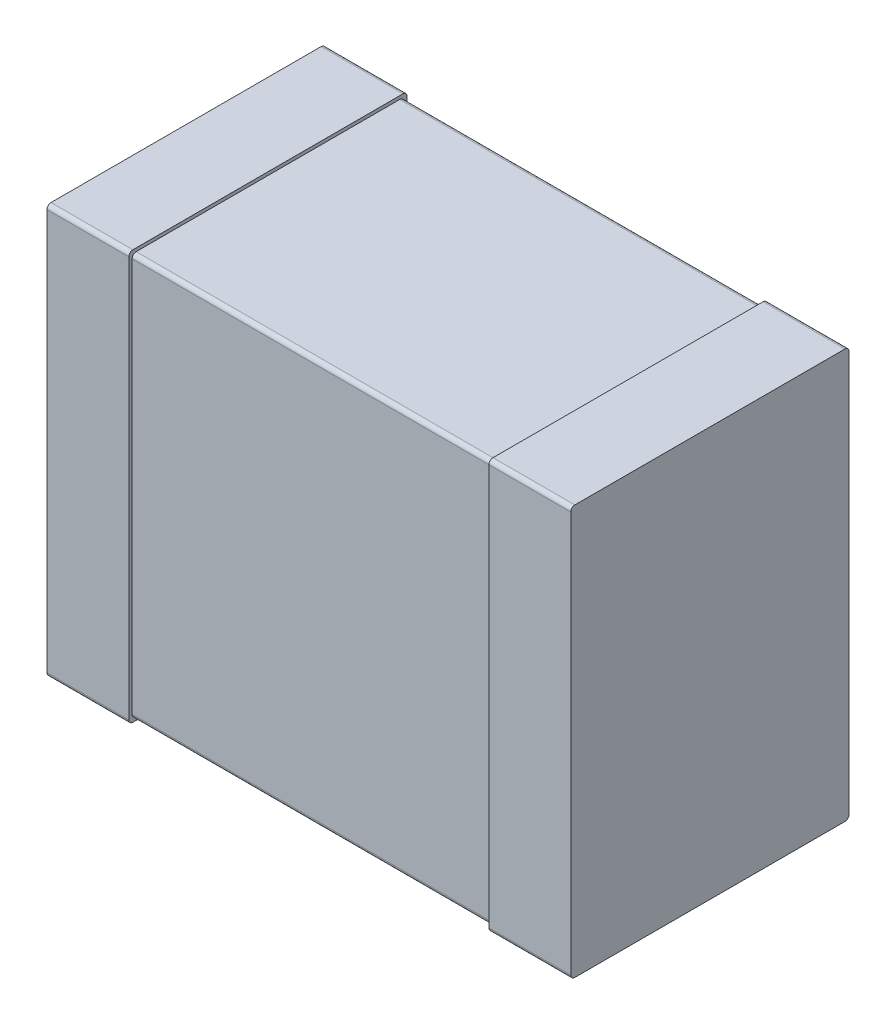
ISO-10303-21;
HEADER;
FILE_DESCRIPTION(('STEP AP214'),'2;1');
FILE_NAME('part.step','',(''),(''),'','','');
FILE_SCHEMA(('AUTOMOTIVE_DESIGN { 1 0 10303 214 1 1 1 1 }'));
ENDSEC;
DATA;
#1=APPLICATION_CONTEXT('core data for automotive mechanical design processes');
#2=APPLICATION_PROTOCOL_DEFINITION('international standard','automotive_design',2000,#1);
#3=PRODUCT_CONTEXT('',#1,'mechanical');
#4=PRODUCT('Part','Part','',(#3));
#5=PRODUCT_RELATED_PRODUCT_CATEGORY('part','',(#4));
#6=PRODUCT_DEFINITION_FORMATION('','',#4);
#7=PRODUCT_DEFINITION_CONTEXT('part definition',#1,'design');
#8=PRODUCT_DEFINITION('design','',#6,#7);
#9=PRODUCT_DEFINITION_SHAPE('','',#8);
#10=(LENGTH_UNIT() NAMED_UNIT(*) SI_UNIT(.MILLI.,.METRE.));
#11=(NAMED_UNIT(*) PLANE_ANGLE_UNIT() SI_UNIT($,.RADIAN.));
#12=(NAMED_UNIT(*) SI_UNIT($,.STERADIAN.) SOLID_ANGLE_UNIT());
#13=UNCERTAINTY_MEASURE_WITH_UNIT(LENGTH_MEASURE(1.E-05),#10,'distance_accuracy_value','');
#14=(GEOMETRIC_REPRESENTATION_CONTEXT(3) GLOBAL_UNCERTAINTY_ASSIGNED_CONTEXT((#13)) GLOBAL_UNIT_ASSIGNED_CONTEXT((#10,
#11,#12)) REPRESENTATION_CONTEXT('',''));
#15=CARTESIAN_POINT('',(0.,0.,0.));
#16=DIRECTION('',(0.,0.,1.));
#17=DIRECTION('',(1.,0.,0.));
#18=AXIS2_PLACEMENT_3D('',#15,#16,#17);
#19=CARTESIAN_POINT('',(-1.6,-1.25,0.));
#20=DIRECTION('',(1.,0.,0.));
#21=DIRECTION('',(0.,0.,-1.));
#22=AXIS2_PLACEMENT_3D('',#19,#20,#21);
#23=PLANE('',#22);
#24=DIRECTION('',(0.,1.,0.));
#25=VECTOR('',#24,1.);
#26=CARTESIAN_POINT('',(-1.6,-1.25,1.7));
#27=LINE('',#26,#25);
#28=CARTESIAN_POINT('',(-1.6,1.225,1.7));
#29=VERTEX_POINT('',#28);
#30=CARTESIAN_POINT('',(-1.6,-1.225,1.7));
#31=VERTEX_POINT('',#30);
#32=EDGE_CURVE('E200',#29,#31,#27,.F.);
#33=ORIENTED_EDGE('',*,*,#32,.F.);
#34=CARTESIAN_POINT('',(-1.6,1.225,1.675));
#35=DIRECTION('',(1.,0.,0.));
#36=DIRECTION('',(0.,0.,-1.));
#37=AXIS2_PLACEMENT_3D('',#34,#35,#36);
#38=CIRCLE('',#37,0.025);
#39=CARTESIAN_POINT('',(-1.6,1.25,1.675));
#40=VERTEX_POINT('',#39);
#41=EDGE_CURVE('E209',#40,#29,#38,.T.);
#42=ORIENTED_EDGE('',*,*,#41,.F.);
#43=DIRECTION('',(0.,0.,1.));
#44=VECTOR('',#43,1.);
#45=CARTESIAN_POINT('',(-1.6,1.25,0.));
#46=LINE('',#45,#44);
#47=CARTESIAN_POINT('',(-1.6,1.25,0.025));
#48=VERTEX_POINT('',#47);
#49=EDGE_CURVE('E213',#48,#40,#46,.T.);
#50=ORIENTED_EDGE('',*,*,#49,.F.);
#51=CARTESIAN_POINT('',(-1.6,1.225,0.025));
#52=DIRECTION('',(1.,0.,0.));
#53=DIRECTION('',(0.,0.,-1.));
#54=AXIS2_PLACEMENT_3D('',#51,#52,#53);
#55=CIRCLE('',#54,0.025);
#56=CARTESIAN_POINT('',(-1.6,1.225,0.));
#57=VERTEX_POINT('',#56);
#58=EDGE_CURVE('E214',#57,#48,#55,.T.);
#59=ORIENTED_EDGE('',*,*,#58,.F.);
#60=DIRECTION('',(0.,1.,0.));
#61=VECTOR('',#60,1.);
#62=CARTESIAN_POINT('',(-1.6,-1.25,0.));
#63=LINE('',#62,#61);
#64=CARTESIAN_POINT('',(-1.6,-1.225,0.));
#65=VERTEX_POINT('',#64);
#66=EDGE_CURVE('E221',#57,#65,#63,.F.);
#67=ORIENTED_EDGE('',*,*,#66,.T.);
#68=CARTESIAN_POINT('',(-1.6,-1.225,0.025));
#69=DIRECTION('',(1.,0.,0.));
#70=DIRECTION('',(0.,0.,-1.));
#71=AXIS2_PLACEMENT_3D('',#68,#69,#70);
#72=CIRCLE('',#71,0.025);
#73=CARTESIAN_POINT('',(-1.6,-1.25,0.025));
#74=VERTEX_POINT('',#73);
#75=EDGE_CURVE('E186',#74,#65,#72,.T.);
#76=ORIENTED_EDGE('',*,*,#75,.F.);
#77=DIRECTION('',(0.,0.,1.));
#78=VECTOR('',#77,1.);
#79=CARTESIAN_POINT('',(-1.6,-1.25,0.));
#80=LINE('',#79,#78);
#81=CARTESIAN_POINT('',(-1.6,-1.25,1.675));
#82=VERTEX_POINT('',#81);
#83=EDGE_CURVE('E184',#74,#82,#80,.T.);
#84=ORIENTED_EDGE('',*,*,#83,.T.);
#85=CARTESIAN_POINT('',(-1.6,-1.225,1.675));
#86=DIRECTION('',(1.,0.,0.));
#87=DIRECTION('',(0.,0.,-1.));
#88=AXIS2_PLACEMENT_3D('',#85,#86,#87);
#89=CIRCLE('',#88,0.025);
#90=EDGE_CURVE('E20',#31,#82,#89,.T.);
#91=ORIENTED_EDGE('',*,*,#90,.F.);
#92=EDGE_LOOP('',(#33,#42,#50,#59,#67,#76,#84,#91));
#93=FACE_BOUND('',#92,.T.);
#94=ADVANCED_FACE('F17',(#93),#23,.F.);
#95=CARTESIAN_POINT('',(1.6,-1.25,0.));
#96=DIRECTION('',(1.,0.,0.));
#97=DIRECTION('',(0.,0.,-1.));
#98=AXIS2_PLACEMENT_3D('',#95,#96,#97);
#99=PLANE('',#98);
#100=DIRECTION('',(0.,1.,0.));
#101=VECTOR('',#100,1.);
#102=CARTESIAN_POINT('',(1.6,-1.25,1.7));
#103=LINE('',#102,#101);
#104=CARTESIAN_POINT('',(1.6,-1.225,1.7));
#105=VERTEX_POINT('',#104);
#106=CARTESIAN_POINT('',(1.6,1.225,1.7));
#107=VERTEX_POINT('',#106);
#108=EDGE_CURVE('E224',#105,#107,#103,.T.);
#109=ORIENTED_EDGE('',*,*,#108,.F.);
#110=CARTESIAN_POINT('',(1.6,-1.225,1.675));
#111=DIRECTION('',(1.,0.,0.));
#112=DIRECTION('',(0.,0.,-1.));
#113=AXIS2_PLACEMENT_3D('',#110,#111,#112);
#114=CIRCLE('',#113,0.025);
#115=CARTESIAN_POINT('',(1.6,-1.25,1.675));
#116=VERTEX_POINT('',#115);
#117=EDGE_CURVE('E182',#105,#116,#114,.T.);
#118=ORIENTED_EDGE('',*,*,#117,.T.);
#119=DIRECTION('',(0.,0.,1.));
#120=VECTOR('',#119,1.);
#121=CARTESIAN_POINT('',(1.6,-1.25,0.));
#122=LINE('',#121,#120);
#123=CARTESIAN_POINT('',(1.6,-1.25,0.025));
#124=VERTEX_POINT('',#123);
#125=EDGE_CURVE('E228',#116,#124,#122,.F.);
#126=ORIENTED_EDGE('',*,*,#125,.T.);
#127=CARTESIAN_POINT('',(1.6,-1.225,0.025));
#128=DIRECTION('',(1.,0.,0.));
#129=DIRECTION('',(0.,0.,-1.));
#130=AXIS2_PLACEMENT_3D('',#127,#128,#129);
#131=CIRCLE('',#130,0.025);
#132=CARTESIAN_POINT('',(1.6,-1.225,0.));
#133=VERTEX_POINT('',#132);
#134=EDGE_CURVE('E231',#133,#124,#131,.F.);
#135=ORIENTED_EDGE('',*,*,#134,.F.);
#136=DIRECTION('',(0.,1.,0.));
#137=VECTOR('',#136,1.);
#138=CARTESIAN_POINT('',(1.6,-1.25,0.));
#139=LINE('',#138,#137);
#140=CARTESIAN_POINT('',(1.6,1.225,0.));
#141=VERTEX_POINT('',#140);
#142=EDGE_CURVE('E236',#133,#141,#139,.T.);
#143=ORIENTED_EDGE('',*,*,#142,.T.);
#144=CARTESIAN_POINT('',(1.6,1.225,0.025));
#145=DIRECTION('',(1.,0.,0.));
#146=DIRECTION('',(0.,0.,-1.));
#147=AXIS2_PLACEMENT_3D('',#144,#145,#146);
#148=CIRCLE('',#147,0.025);
#149=CARTESIAN_POINT('',(1.6,1.25,0.025));
#150=VERTEX_POINT('',#149);
#151=EDGE_CURVE('E239',#150,#141,#148,.F.);
#152=ORIENTED_EDGE('',*,*,#151,.F.);
#153=DIRECTION('',(0.,0.,1.));
#154=VECTOR('',#153,1.);
#155=CARTESIAN_POINT('',(1.6,1.25,0.));
#156=LINE('',#155,#154);
#157=CARTESIAN_POINT('',(1.6,1.25,1.675));
#158=VERTEX_POINT('',#157);
#159=EDGE_CURVE('E232',#158,#150,#156,.F.);
#160=ORIENTED_EDGE('',*,*,#159,.F.);
#161=CARTESIAN_POINT('',(1.6,1.225,1.675));
#162=DIRECTION('',(1.,0.,0.));
#163=DIRECTION('',(0.,0.,-1.));
#164=AXIS2_PLACEMENT_3D('',#161,#162,#163);
#165=CIRCLE('',#164,0.025);
#166=EDGE_CURVE('E286',#107,#158,#165,.F.);
#167=ORIENTED_EDGE('',*,*,#166,.F.);
#168=EDGE_LOOP('',(#109,#118,#126,#135,#143,#152,#160,#167));
#169=FACE_BOUND('',#168,.T.);
#170=ADVANCED_FACE('F303',(#169),#99,.T.);
#171=CARTESIAN_POINT('',(-1.1,-1.205,1.655));
#172=DIRECTION('',(1.,0.,0.));
#173=DIRECTION('',(0.,0.,-1.));
#174=AXIS2_PLACEMENT_3D('',#171,#172,#173);
#175=CYLINDRICAL_SURFACE('',#174,0.025);
#176=DIRECTION('',(1.,0.,0.));
#177=VECTOR('',#176,1.);
#178=CARTESIAN_POINT('',(-1.1,-1.205,1.68));
#179=LINE('',#178,#177);
#180=CARTESIAN_POINT('',(-1.1,-1.205,1.68));
#181=VERTEX_POINT('',#180);
#182=CARTESIAN_POINT('',(1.1,-1.205,1.68));
#183=VERTEX_POINT('',#182);
#184=EDGE_CURVE('E318',#181,#183,#179,.T.);
#185=ORIENTED_EDGE('',*,*,#184,.F.);
#186=CARTESIAN_POINT('',(-1.1,-1.205,1.655));
#187=DIRECTION('',(1.,0.,0.));
#188=DIRECTION('',(0.,0.,-1.));
#189=AXIS2_PLACEMENT_3D('',#186,#187,#188);
#190=CIRCLE('',#189,0.025);
#191=CARTESIAN_POINT('',(-1.1,-1.23,1.655));
#192=VERTEX_POINT('',#191);
#193=EDGE_CURVE('E297',#181,#192,#190,.T.);
#194=ORIENTED_EDGE('',*,*,#193,.T.);
#195=DIRECTION('',(1.,0.,0.));
#196=VECTOR('',#195,1.);
#197=CARTESIAN_POINT('',(-1.1,-1.23,1.655));
#198=LINE('',#197,#196);
#199=CARTESIAN_POINT('',(1.1,-1.23,1.655));
#200=VERTEX_POINT('',#199);
#201=EDGE_CURVE('E203',#192,#200,#198,.T.);
#202=ORIENTED_EDGE('',*,*,#201,.T.);
#203=CARTESIAN_POINT('',(1.1,-1.205,1.655));
#204=DIRECTION('',(1.,0.,0.));
#205=DIRECTION('',(0.,0.,-1.));
#206=AXIS2_PLACEMENT_3D('',#203,#204,#205);
#207=CIRCLE('',#206,0.025);
#208=EDGE_CURVE('E299',#200,#183,#207,.F.);
#209=ORIENTED_EDGE('',*,*,#208,.T.);
#210=EDGE_LOOP('',(#185,#194,#202,#209));
#211=FACE_BOUND('',#210,.T.);
#212=ADVANCED_FACE('F335',(#211),#175,.T.);
#213=CARTESIAN_POINT('',(-1.1,1.205,1.655));
#214=DIRECTION('',(1.,0.,0.));
#215=DIRECTION('',(0.,0.,-1.));
#216=AXIS2_PLACEMENT_3D('',#213,#214,#215);
#217=CYLINDRICAL_SURFACE('',#216,0.025);
#218=CARTESIAN_POINT('',(1.1,1.205,1.655));
#219=DIRECTION('',(1.,0.,0.));
#220=DIRECTION('',(0.,0.,-1.));
#221=AXIS2_PLACEMENT_3D('',#218,#219,#220);
#222=CIRCLE('',#221,0.025);
#223=CARTESIAN_POINT('',(1.1,1.205,1.68));
#224=VERTEX_POINT('',#223);
#225=CARTESIAN_POINT('',(1.1,1.23,1.655));
#226=VERTEX_POINT('',#225);
#227=EDGE_CURVE('E190',#224,#226,#222,.F.);
#228=ORIENTED_EDGE('',*,*,#227,.T.);
#229=DIRECTION('',(1.,0.,0.));
#230=VECTOR('',#229,1.);
#231=CARTESIAN_POINT('',(-1.1,1.23,1.655));
#232=LINE('',#231,#230);
#233=CARTESIAN_POINT('',(-1.1,1.23,1.655));
#234=VERTEX_POINT('',#233);
#235=EDGE_CURVE('E357',#234,#226,#232,.T.);
#236=ORIENTED_EDGE('',*,*,#235,.F.);
#237=CARTESIAN_POINT('',(-1.1,1.205,1.655));
#238=DIRECTION('',(1.,0.,0.));
#239=DIRECTION('',(0.,0.,-1.));
#240=AXIS2_PLACEMENT_3D('',#237,#238,#239);
#241=CIRCLE('',#240,0.025);
#242=CARTESIAN_POINT('',(-1.1,1.205,1.68));
#243=VERTEX_POINT('',#242);
#244=EDGE_CURVE('E295',#234,#243,#241,.T.);
#245=ORIENTED_EDGE('',*,*,#244,.T.);
#246=DIRECTION('',(1.,0.,0.));
#247=VECTOR('',#246,1.);
#248=CARTESIAN_POINT('',(-1.1,1.205,1.68));
#249=LINE('',#248,#247);
#250=EDGE_CURVE('E362',#224,#243,#249,.F.);
#251=ORIENTED_EDGE('',*,*,#250,.F.);
#252=EDGE_LOOP('',(#228,#236,#245,#251));
#253=FACE_BOUND('',#252,.T.);
#254=ADVANCED_FACE('F608',(#253),#217,.T.);
#255=CARTESIAN_POINT('',(-1.6,-1.25,0.));
#256=DIRECTION('',(0.,1.,0.));
#257=DIRECTION('',(0.,0.,1.));
#258=AXIS2_PLACEMENT_3D('',#255,#256,#257);
#259=PLANE('',#258);
#260=ORIENTED_EDGE('',*,*,#83,.F.);
#261=DIRECTION('',(1.,0.,0.));
#262=VECTOR('',#261,1.);
#263=CARTESIAN_POINT('',(-1.6,-1.25,0.025));
#264=LINE('',#263,#262);
#265=CARTESIAN_POINT('',(-1.1,-1.25,0.025));
#266=VERTEX_POINT('',#265);
#267=EDGE_CURVE('E222',#266,#74,#264,.F.);
#268=ORIENTED_EDGE('',*,*,#267,.F.);
#269=DIRECTION('',(0.,0.,-1.));
#270=VECTOR('',#269,1.);
#271=CARTESIAN_POINT('',(-1.1,-1.25,0.));
#272=LINE('',#271,#270);
#273=CARTESIAN_POINT('',(-1.1,-1.25,1.675));
#274=VERTEX_POINT('',#273);
#275=EDGE_CURVE('E194',#274,#266,#272,.T.);
#276=ORIENTED_EDGE('',*,*,#275,.F.);
#277=DIRECTION('',(1.,0.,0.));
#278=VECTOR('',#277,1.);
#279=CARTESIAN_POINT('',(-1.6,-1.25,1.675));
#280=LINE('',#279,#278);
#281=EDGE_CURVE('E178',#82,#274,#280,.T.);
#282=ORIENTED_EDGE('',*,*,#281,.F.);
#283=EDGE_LOOP('',(#260,#268,#276,#282));
#284=FACE_BOUND('',#283,.T.);
#285=ADVANCED_FACE('F193',(#284),#259,.F.);
#286=CARTESIAN_POINT('',(-1.6,-1.225,0.025));
#287=DIRECTION('',(1.,0.,0.));
#288=DIRECTION('',(0.,0.,-1.));
#289=AXIS2_PLACEMENT_3D('',#286,#287,#288);
#290=CYLINDRICAL_SURFACE('',#289,0.025);
#291=CARTESIAN_POINT('',(-1.1,-1.225,0.025));
#292=DIRECTION('',(1.,0.,0.));
#293=DIRECTION('',(0.,0.,-1.));
#294=AXIS2_PLACEMENT_3D('',#291,#292,#293);
#295=CIRCLE('',#294,0.025);
#296=CARTESIAN_POINT('',(-1.1,-1.225,0.));
#297=VERTEX_POINT('',#296);
#298=EDGE_CURVE('E284',#266,#297,#295,.T.);
#299=ORIENTED_EDGE('',*,*,#298,.F.);
#300=ORIENTED_EDGE('',*,*,#267,.T.);
#301=ORIENTED_EDGE('',*,*,#75,.T.);
#302=DIRECTION('',(1.,0.,0.));
#303=VECTOR('',#302,1.);
#304=CARTESIAN_POINT('',(-1.6,-1.225,0.));
#305=LINE('',#304,#303);
#306=EDGE_CURVE('E218',#65,#297,#305,.T.);
#307=ORIENTED_EDGE('',*,*,#306,.T.);
#308=EDGE_LOOP('',(#299,#300,#301,#307));
#309=FACE_BOUND('',#308,.T.);
#310=ADVANCED_FACE('F589',(#309),#290,.T.);
#311=CARTESIAN_POINT('',(-1.6,-1.25,0.));
#312=DIRECTION('',(0.,0.,1.));
#313=DIRECTION('',(1.,0.,0.));
#314=AXIS2_PLACEMENT_3D('',#311,#312,#313);
#315=PLANE('',#314);
#316=DIRECTION('',(0.,1.,0.));
#317=VECTOR('',#316,1.);
#318=CARTESIAN_POINT('',(-1.1,-1.25,0.));
#319=LINE('',#318,#317);
#320=CARTESIAN_POINT('',(-1.1,1.225,0.));
#321=VERTEX_POINT('',#320);
#322=EDGE_CURVE('E283',#297,#321,#319,.T.);
#323=ORIENTED_EDGE('',*,*,#322,.F.);
#324=ORIENTED_EDGE('',*,*,#306,.F.);
#325=ORIENTED_EDGE('',*,*,#66,.F.);
#326=DIRECTION('',(1.,0.,0.));
#327=VECTOR('',#326,1.);
#328=CARTESIAN_POINT('',(-1.6,1.225,0.));
#329=LINE('',#328,#327);
#330=EDGE_CURVE('E215',#321,#57,#329,.F.);
#331=ORIENTED_EDGE('',*,*,#330,.F.);
#332=EDGE_LOOP('',(#323,#324,#325,#331));
#333=FACE_BOUND('',#332,.T.);
#334=ADVANCED_FACE('F579',(#333),#315,.F.);
#335=CARTESIAN_POINT('',(-1.6,1.225,0.025));
#336=DIRECTION('',(1.,0.,0.));
#337=DIRECTION('',(0.,0.,-1.));
#338=AXIS2_PLACEMENT_3D('',#335,#336,#337);
#339=CYLINDRICAL_SURFACE('',#338,0.025);
#340=ORIENTED_EDGE('',*,*,#330,.T.);
#341=ORIENTED_EDGE('',*,*,#58,.T.);
#342=DIRECTION('',(1.,0.,0.));
#343=VECTOR('',#342,1.);
#344=CARTESIAN_POINT('',(-1.6,1.25,0.025));
#345=LINE('',#344,#343);
#346=CARTESIAN_POINT('',(-1.1,1.25,0.025));
#347=VERTEX_POINT('',#346);
#348=EDGE_CURVE('E210',#347,#48,#345,.F.);
#349=ORIENTED_EDGE('',*,*,#348,.F.);
#350=CARTESIAN_POINT('',(-1.1,1.225,0.025));
#351=DIRECTION('',(1.,0.,0.));
#352=DIRECTION('',(0.,0.,-1.));
#353=AXIS2_PLACEMENT_3D('',#350,#351,#352);
#354=CIRCLE('',#353,0.025);
#355=EDGE_CURVE('E281',#321,#347,#354,.T.);
#356=ORIENTED_EDGE('',*,*,#355,.F.);
#357=EDGE_LOOP('',(#340,#341,#349,#356));
#358=FACE_BOUND('',#357,.T.);
#359=ADVANCED_FACE('F569',(#358),#339,.T.);
#360=CARTESIAN_POINT('',(-1.6,1.25,0.));
#361=DIRECTION('',(0.,1.,0.));
#362=DIRECTION('',(0.,0.,1.));
#363=AXIS2_PLACEMENT_3D('',#360,#361,#362);
#364=PLANE('',#363);
#365=ORIENTED_EDGE('',*,*,#49,.T.);
#366=DIRECTION('',(1.,0.,0.));
#367=VECTOR('',#366,1.);
#368=CARTESIAN_POINT('',(-1.6,1.25,1.675));
#369=LINE('',#368,#367);
#370=CARTESIAN_POINT('',(-1.1,1.25,1.675));
#371=VERTEX_POINT('',#370);
#372=EDGE_CURVE('E206',#371,#40,#369,.F.);
#373=ORIENTED_EDGE('',*,*,#372,.F.);
#374=DIRECTION('',(0.,0.,-1.));
#375=VECTOR('',#374,1.);
#376=CARTESIAN_POINT('',(-1.1,1.25,0.));
#377=LINE('',#376,#375);
#378=EDGE_CURVE('E280',#347,#371,#377,.F.);
#379=ORIENTED_EDGE('',*,*,#378,.F.);
#380=ORIENTED_EDGE('',*,*,#348,.T.);
#381=EDGE_LOOP('',(#365,#373,#379,#380));
#382=FACE_BOUND('',#381,.T.);
#383=ADVANCED_FACE('F559',(#382),#364,.T.);
#384=CARTESIAN_POINT('',(-1.6,1.225,1.675));
#385=DIRECTION('',(1.,0.,0.));
#386=DIRECTION('',(0.,0.,-1.));
#387=AXIS2_PLACEMENT_3D('',#384,#385,#386);
#388=CYLINDRICAL_SURFACE('',#387,0.025);
#389=CARTESIAN_POINT('',(-1.1,1.225,1.675));
#390=DIRECTION('',(1.,0.,0.));
#391=DIRECTION('',(0.,0.,-1.));
#392=AXIS2_PLACEMENT_3D('',#389,#390,#391);
#393=CIRCLE('',#392,0.025);
#394=CARTESIAN_POINT('',(-1.1,1.225,1.7));
#395=VERTEX_POINT('',#394);
#396=EDGE_CURVE('E278',#371,#395,#393,.T.);
#397=ORIENTED_EDGE('',*,*,#396,.F.);
#398=ORIENTED_EDGE('',*,*,#372,.T.);
#399=ORIENTED_EDGE('',*,*,#41,.T.);
#400=DIRECTION('',(1.,0.,0.));
#401=VECTOR('',#400,1.);
#402=CARTESIAN_POINT('',(-1.6,1.225,1.7));
#403=LINE('',#402,#401);
#404=EDGE_CURVE('E195',#395,#29,#403,.F.);
#405=ORIENTED_EDGE('',*,*,#404,.F.);
#406=EDGE_LOOP('',(#397,#398,#399,#405));
#407=FACE_BOUND('',#406,.T.);
#408=ADVANCED_FACE('F549',(#407),#388,.T.);
#409=CARTESIAN_POINT('',(-1.6,-1.25,1.7));
#410=DIRECTION('',(0.,0.,1.));
#411=DIRECTION('',(1.,0.,0.));
#412=AXIS2_PLACEMENT_3D('',#409,#410,#411);
#413=PLANE('',#412);
#414=DIRECTION('',(0.,1.,0.));
#415=VECTOR('',#414,1.);
#416=CARTESIAN_POINT('',(-1.1,-1.25,1.7));
#417=LINE('',#416,#415);
#418=CARTESIAN_POINT('',(-1.1,-1.225,1.7));
#419=VERTEX_POINT('',#418);
#420=EDGE_CURVE('E277',#395,#419,#417,.F.);
#421=ORIENTED_EDGE('',*,*,#420,.F.);
#422=ORIENTED_EDGE('',*,*,#404,.T.);
#423=ORIENTED_EDGE('',*,*,#32,.T.);
#424=DIRECTION('',(1.,0.,0.));
#425=VECTOR('',#424,1.);
#426=CARTESIAN_POINT('',(-1.6,-1.225,1.7));
#427=LINE('',#426,#425);
#428=EDGE_CURVE('E181',#419,#31,#427,.F.);
#429=ORIENTED_EDGE('',*,*,#428,.F.);
#430=EDGE_LOOP('',(#421,#422,#423,#429));
#431=FACE_BOUND('',#430,.T.);
#432=ADVANCED_FACE('F540',(#431),#413,.T.);
#433=CARTESIAN_POINT('',(-1.6,-1.225,1.675));
#434=DIRECTION('',(1.,0.,0.));
#435=DIRECTION('',(0.,0.,-1.));
#436=AXIS2_PLACEMENT_3D('',#433,#434,#435);
#437=CYLINDRICAL_SURFACE('',#436,0.025);
#438=ORIENTED_EDGE('',*,*,#428,.T.);
#439=ORIENTED_EDGE('',*,*,#90,.T.);
#440=ORIENTED_EDGE('',*,*,#281,.T.);
#441=CARTESIAN_POINT('',(-1.1,-1.225,1.675));
#442=DIRECTION('',(1.,0.,0.));
#443=DIRECTION('',(0.,0.,-1.));
#444=AXIS2_PLACEMENT_3D('',#441,#442,#443);
#445=CIRCLE('',#444,0.025);
#446=EDGE_CURVE('E274',#419,#274,#445,.T.);
#447=ORIENTED_EDGE('',*,*,#446,.F.);
#448=EDGE_LOOP('',(#438,#439,#440,#447));
#449=FACE_BOUND('',#448,.T.);
#450=ADVANCED_FACE('F175',(#449),#437,.T.);
#451=CARTESIAN_POINT('',(-1.1,-1.23,0.02));
#452=DIRECTION('',(0.,1.,0.));
#453=DIRECTION('',(0.,0.,1.));
#454=AXIS2_PLACEMENT_3D('',#451,#452,#453);
#455=PLANE('',#454);
#456=DIRECTION('',(0.,0.,-1.));
#457=VECTOR('',#456,1.);
#458=CARTESIAN_POINT('',(-1.1,-1.23,0.));
#459=LINE('',#458,#457);
#460=CARTESIAN_POINT('',(-1.1,-1.23,0.045));
#461=VERTEX_POINT('',#460);
#462=EDGE_CURVE('E276',#461,#192,#459,.F.);
#463=ORIENTED_EDGE('',*,*,#462,.F.);
#464=DIRECTION('',(1.,0.,0.));
#465=VECTOR('',#464,1.);
#466=CARTESIAN_POINT('',(-1.1,-1.23,0.045));
#467=LINE('',#466,#465);
#468=CARTESIAN_POINT('',(1.1,-1.23,0.045));
#469=VERTEX_POINT('',#468);
#470=EDGE_CURVE('E272',#469,#461,#467,.F.);
#471=ORIENTED_EDGE('',*,*,#470,.F.);
#472=DIRECTION('',(0.,0.,1.));
#473=VECTOR('',#472,1.);
#474=CARTESIAN_POINT('',(1.1,-1.23,0.02));
#475=LINE('',#474,#473);
#476=EDGE_CURVE('E197',#200,#469,#475,.F.);
#477=ORIENTED_EDGE('',*,*,#476,.F.);
#478=ORIENTED_EDGE('',*,*,#201,.F.);
#479=EDGE_LOOP('',(#463,#471,#477,#478));
#480=FACE_BOUND('',#479,.T.);
#481=ADVANCED_FACE('F339',(#480),#455,.F.);
#482=CARTESIAN_POINT('',(1.1,-1.25,0.));
#483=DIRECTION('',(0.,1.,0.));
#484=DIRECTION('',(0.,0.,1.));
#485=AXIS2_PLACEMENT_3D('',#482,#483,#484);
#486=PLANE('',#485);
#487=DIRECTION('',(0.,0.,-1.));
#488=VECTOR('',#487,1.);
#489=CARTESIAN_POINT('',(1.1,-1.25,0.));
#490=LINE('',#489,#488);
#491=CARTESIAN_POINT('',(1.1,-1.25,1.675));
#492=VERTEX_POINT('',#491);
#493=CARTESIAN_POINT('',(1.1,-1.25,0.025));
#494=VERTEX_POINT('',#493);
#495=EDGE_CURVE('E269',#492,#494,#490,.T.);
#496=ORIENTED_EDGE('',*,*,#495,.T.);
#497=DIRECTION('',(1.,0.,0.));
#498=VECTOR('',#497,1.);
#499=CARTESIAN_POINT('',(1.1,-1.25,0.025));
#500=LINE('',#499,#498);
#501=EDGE_CURVE('E290',#124,#494,#500,.F.);
#502=ORIENTED_EDGE('',*,*,#501,.F.);
#503=ORIENTED_EDGE('',*,*,#125,.F.);
#504=DIRECTION('',(1.,0.,0.));
#505=VECTOR('',#504,1.);
#506=CARTESIAN_POINT('',(1.1,-1.25,1.675));
#507=LINE('',#506,#505);
#508=EDGE_CURVE('E313',#492,#116,#507,.T.);
#509=ORIENTED_EDGE('',*,*,#508,.F.);
#510=EDGE_LOOP('',(#496,#502,#503,#509));
#511=FACE_BOUND('',#510,.T.);
#512=ADVANCED_FACE('F312',(#511),#486,.F.);
#513=CARTESIAN_POINT('',(1.1,-1.225,0.025));
#514=DIRECTION('',(1.,0.,0.));
#515=DIRECTION('',(0.,0.,-1.));
#516=AXIS2_PLACEMENT_3D('',#513,#514,#515);
#517=CYLINDRICAL_SURFACE('',#516,0.025);
#518=ORIENTED_EDGE('',*,*,#134,.T.);
#519=ORIENTED_EDGE('',*,*,#501,.T.);
#520=CARTESIAN_POINT('',(1.1,-1.225,0.025));
#521=DIRECTION('',(1.,0.,0.));
#522=DIRECTION('',(0.,0.,-1.));
#523=AXIS2_PLACEMENT_3D('',#520,#521,#522);
#524=CIRCLE('',#523,0.025);
#525=CARTESIAN_POINT('',(1.1,-1.225,0.));
#526=VERTEX_POINT('',#525);
#527=EDGE_CURVE('E266',#494,#526,#524,.T.);
#528=ORIENTED_EDGE('',*,*,#527,.T.);
#529=DIRECTION('',(1.,0.,0.));
#530=VECTOR('',#529,1.);
#531=CARTESIAN_POINT('',(1.1,-1.225,0.));
#532=LINE('',#531,#530);
#533=EDGE_CURVE('E240',#526,#133,#532,.T.);
#534=ORIENTED_EDGE('',*,*,#533,.T.);
#535=EDGE_LOOP('',(#518,#519,#528,#534));
#536=FACE_BOUND('',#535,.T.);
#537=ADVANCED_FACE('F505',(#536),#517,.T.);
#538=CARTESIAN_POINT('',(1.1,-1.25,0.));
#539=DIRECTION('',(0.,0.,1.));
#540=DIRECTION('',(1.,0.,0.));
#541=AXIS2_PLACEMENT_3D('',#538,#539,#540);
#542=PLANE('',#541);
#543=ORIENTED_EDGE('',*,*,#142,.F.);
#544=ORIENTED_EDGE('',*,*,#533,.F.);
#545=DIRECTION('',(0.,1.,0.));
#546=VECTOR('',#545,1.);
#547=CARTESIAN_POINT('',(1.1,-1.25,0.));
#548=LINE('',#547,#546);
#549=CARTESIAN_POINT('',(1.1,1.225,0.));
#550=VERTEX_POINT('',#549);
#551=EDGE_CURVE('E265',#526,#550,#548,.T.);
#552=ORIENTED_EDGE('',*,*,#551,.T.);
#553=DIRECTION('',(1.,0.,0.));
#554=VECTOR('',#553,1.);
#555=CARTESIAN_POINT('',(1.1,1.225,0.));
#556=LINE('',#555,#554);
#557=EDGE_CURVE('E235',#141,#550,#556,.F.);
#558=ORIENTED_EDGE('',*,*,#557,.F.);
#559=EDGE_LOOP('',(#543,#544,#552,#558));
#560=FACE_BOUND('',#559,.T.);
#561=ADVANCED_FACE('F495',(#560),#542,.F.);
#562=CARTESIAN_POINT('',(1.1,1.225,0.025));
#563=DIRECTION('',(1.,0.,0.));
#564=DIRECTION('',(0.,0.,-1.));
#565=AXIS2_PLACEMENT_3D('',#562,#563,#564);
#566=CYLINDRICAL_SURFACE('',#565,0.025);
#567=ORIENTED_EDGE('',*,*,#557,.T.);
#568=CARTESIAN_POINT('',(1.1,1.225,0.025));
#569=DIRECTION('',(1.,0.,0.));
#570=DIRECTION('',(0.,0.,-1.));
#571=AXIS2_PLACEMENT_3D('',#568,#569,#570);
#572=CIRCLE('',#571,0.025);
#573=CARTESIAN_POINT('',(1.1,1.25,0.025));
#574=VERTEX_POINT('',#573);
#575=EDGE_CURVE('E262',#550,#574,#572,.T.);
#576=ORIENTED_EDGE('',*,*,#575,.T.);
#577=DIRECTION('',(1.,0.,0.));
#578=VECTOR('',#577,1.);
#579=CARTESIAN_POINT('',(1.1,1.25,0.025));
#580=LINE('',#579,#578);
#581=EDGE_CURVE('E234',#150,#574,#580,.F.);
#582=ORIENTED_EDGE('',*,*,#581,.F.);
#583=ORIENTED_EDGE('',*,*,#151,.T.);
#584=EDGE_LOOP('',(#567,#576,#582,#583));
#585=FACE_BOUND('',#584,.T.);
#586=ADVANCED_FACE('F485',(#585),#566,.T.);
#587=CARTESIAN_POINT('',(1.1,1.25,0.));
#588=DIRECTION('',(0.,1.,0.));
#589=DIRECTION('',(0.,0.,1.));
#590=AXIS2_PLACEMENT_3D('',#587,#588,#589);
#591=PLANE('',#590);
#592=DIRECTION('',(0.,0.,-1.));
#593=VECTOR('',#592,1.);
#594=CARTESIAN_POINT('',(1.1,1.25,0.));
#595=LINE('',#594,#593);
#596=CARTESIAN_POINT('',(1.1,1.25,1.675));
#597=VERTEX_POINT('',#596);
#598=EDGE_CURVE('E261',#574,#597,#595,.F.);
#599=ORIENTED_EDGE('',*,*,#598,.T.);
#600=DIRECTION('',(1.,0.,0.));
#601=VECTOR('',#600,1.);
#602=CARTESIAN_POINT('',(1.1,1.25,1.675));
#603=LINE('',#602,#601);
#604=EDGE_CURVE('E227',#158,#597,#603,.F.);
#605=ORIENTED_EDGE('',*,*,#604,.F.);
#606=ORIENTED_EDGE('',*,*,#159,.T.);
#607=ORIENTED_EDGE('',*,*,#581,.T.);
#608=EDGE_LOOP('',(#599,#605,#606,#607));
#609=FACE_BOUND('',#608,.T.);
#610=ADVANCED_FACE('F475',(#609),#591,.T.);
#611=CARTESIAN_POINT('',(1.1,1.225,1.675));
#612=DIRECTION('',(1.,0.,0.));
#613=DIRECTION('',(0.,0.,-1.));
#614=AXIS2_PLACEMENT_3D('',#611,#612,#613);
#615=CYLINDRICAL_SURFACE('',#614,0.025);
#616=ORIENTED_EDGE('',*,*,#166,.T.);
#617=ORIENTED_EDGE('',*,*,#604,.T.);
#618=CARTESIAN_POINT('',(1.1,1.225,1.675));
#619=DIRECTION('',(1.,0.,0.));
#620=DIRECTION('',(0.,0.,-1.));
#621=AXIS2_PLACEMENT_3D('',#618,#619,#620);
#622=CIRCLE('',#621,0.025);
#623=CARTESIAN_POINT('',(1.1,1.225,1.7));
#624=VERTEX_POINT('',#623);
#625=EDGE_CURVE('E258',#597,#624,#622,.T.);
#626=ORIENTED_EDGE('',*,*,#625,.T.);
#627=DIRECTION('',(1.,0.,0.));
#628=VECTOR('',#627,1.);
#629=CARTESIAN_POINT('',(1.1,1.225,1.7));
#630=LINE('',#629,#628);
#631=EDGE_CURVE('E226',#107,#624,#630,.F.);
#632=ORIENTED_EDGE('',*,*,#631,.F.);
#633=EDGE_LOOP('',(#616,#617,#626,#632));
#634=FACE_BOUND('',#633,.T.);
#635=ADVANCED_FACE('F465',(#634),#615,.T.);
#636=CARTESIAN_POINT('',(1.1,-1.25,1.7));
#637=DIRECTION('',(0.,0.,1.));
#638=DIRECTION('',(1.,0.,0.));
#639=AXIS2_PLACEMENT_3D('',#636,#637,#638);
#640=PLANE('',#639);
#641=ORIENTED_EDGE('',*,*,#108,.T.);
#642=ORIENTED_EDGE('',*,*,#631,.T.);
#643=DIRECTION('',(0.,1.,0.));
#644=VECTOR('',#643,1.);
#645=CARTESIAN_POINT('',(1.1,-1.25,1.7));
#646=LINE('',#645,#644);
#647=CARTESIAN_POINT('',(1.1,-1.225,1.7));
#648=VERTEX_POINT('',#647);
#649=EDGE_CURVE('E257',#624,#648,#646,.F.);
#650=ORIENTED_EDGE('',*,*,#649,.T.);
#651=DIRECTION('',(1.,0.,0.));
#652=VECTOR('',#651,1.);
#653=CARTESIAN_POINT('',(1.1,-1.225,1.7));
#654=LINE('',#653,#652);
#655=EDGE_CURVE('E316',#105,#648,#654,.F.);
#656=ORIENTED_EDGE('',*,*,#655,.F.);
#657=EDGE_LOOP('',(#641,#642,#650,#656));
#658=FACE_BOUND('',#657,.T.);
#659=ADVANCED_FACE('F456',(#658),#640,.T.);
#660=CARTESIAN_POINT('',(1.1,-1.225,1.675));
#661=DIRECTION('',(1.,0.,0.));
#662=DIRECTION('',(0.,0.,-1.));
#663=AXIS2_PLACEMENT_3D('',#660,#661,#662);
#664=CYLINDRICAL_SURFACE('',#663,0.025);
#665=ORIENTED_EDGE('',*,*,#655,.T.);
#666=CARTESIAN_POINT('',(1.1,-1.225,1.675));
#667=DIRECTION('',(1.,0.,0.));
#668=DIRECTION('',(0.,0.,-1.));
#669=AXIS2_PLACEMENT_3D('',#666,#667,#668);
#670=CIRCLE('',#669,0.025);
#671=EDGE_CURVE('E254',#648,#492,#670,.T.);
#672=ORIENTED_EDGE('',*,*,#671,.T.);
#673=ORIENTED_EDGE('',*,*,#508,.T.);
#674=ORIENTED_EDGE('',*,*,#117,.F.);
#675=EDGE_LOOP('',(#665,#672,#673,#674));
#676=FACE_BOUND('',#675,.T.);
#677=ADVANCED_FACE('F314',(#676),#664,.T.);
#678=CARTESIAN_POINT('',(-1.1,-1.23,1.68));
#679=DIRECTION('',(0.,0.,1.));
#680=DIRECTION('',(1.,0.,0.));
#681=AXIS2_PLACEMENT_3D('',#678,#679,#680);
#682=PLANE('',#681);
#683=DIRECTION('',(0.,1.,0.));
#684=VECTOR('',#683,1.);
#685=CARTESIAN_POINT('',(1.1,-1.25,1.68));
#686=LINE('',#685,#684);
#687=EDGE_CURVE('E253',#183,#224,#686,.T.);
#688=ORIENTED_EDGE('',*,*,#687,.T.);
#689=ORIENTED_EDGE('',*,*,#250,.T.);
#690=DIRECTION('',(0.,1.,0.));
#691=VECTOR('',#690,1.);
#692=CARTESIAN_POINT('',(-1.1,-1.25,1.68));
#693=LINE('',#692,#691);
#694=EDGE_CURVE('E348',#181,#243,#693,.T.);
#695=ORIENTED_EDGE('',*,*,#694,.F.);
#696=ORIENTED_EDGE('',*,*,#184,.T.);
#697=EDGE_LOOP('',(#688,#689,#695,#696));
#698=FACE_BOUND('',#697,.T.);
#699=ADVANCED_FACE('F438',(#698),#682,.T.);
#700=CARTESIAN_POINT('',(-1.1,1.23,0.02));
#701=DIRECTION('',(0.,1.,0.));
#702=DIRECTION('',(0.,0.,1.));
#703=AXIS2_PLACEMENT_3D('',#700,#701,#702);
#704=PLANE('',#703);
#705=DIRECTION('',(0.,0.,-1.));
#706=VECTOR('',#705,1.);
#707=CARTESIAN_POINT('',(-1.1,1.23,0.));
#708=LINE('',#707,#706);
#709=CARTESIAN_POINT('',(-1.1,1.23,0.045));
#710=VERTEX_POINT('',#709);
#711=EDGE_CURVE('E273',#234,#710,#708,.T.);
#712=ORIENTED_EDGE('',*,*,#711,.F.);
#713=ORIENTED_EDGE('',*,*,#235,.T.);
#714=DIRECTION('',(0.,0.,-1.));
#715=VECTOR('',#714,1.);
#716=CARTESIAN_POINT('',(1.1,1.23,0.));
#717=LINE('',#716,#715);
#718=CARTESIAN_POINT('',(1.1,1.23,0.045));
#719=VERTEX_POINT('',#718);
#720=EDGE_CURVE('E359',#226,#719,#717,.T.);
#721=ORIENTED_EDGE('',*,*,#720,.T.);
#722=DIRECTION('',(1.,0.,0.));
#723=VECTOR('',#722,1.);
#724=CARTESIAN_POINT('',(-1.1,1.23,0.045));
#725=LINE('',#724,#723);
#726=EDGE_CURVE('E249',#710,#719,#725,.T.);
#727=ORIENTED_EDGE('',*,*,#726,.F.);
#728=EDGE_LOOP('',(#712,#713,#721,#727));
#729=FACE_BOUND('',#728,.T.);
#730=ADVANCED_FACE('F382',(#729),#704,.T.);
#731=CARTESIAN_POINT('',(-1.1,-1.25,0.));
#732=DIRECTION('',(1.,0.,0.));
#733=DIRECTION('',(0.,0.,-1.));
#734=AXIS2_PLACEMENT_3D('',#731,#732,#733);
#735=PLANE('',#734);
#736=CARTESIAN_POINT('',(-1.1,1.205,0.045));
#737=DIRECTION('',(1.,0.,0.));
#738=DIRECTION('',(0.,0.,-1.));
#739=AXIS2_PLACEMENT_3D('',#736,#737,#738);
#740=CIRCLE('',#739,0.025);
#741=CARTESIAN_POINT('',(-1.1,1.205,0.02));
#742=VERTEX_POINT('',#741);
#743=EDGE_CURVE('E244',#742,#710,#740,.T.);
#744=ORIENTED_EDGE('',*,*,#743,.F.);
#745=DIRECTION('',(0.,1.,0.));
#746=VECTOR('',#745,1.);
#747=CARTESIAN_POINT('',(-1.1,-1.23,0.02));
#748=LINE('',#747,#746);
#749=CARTESIAN_POINT('',(-1.1,-1.205,0.02));
#750=VERTEX_POINT('',#749);
#751=EDGE_CURVE('E247',#742,#750,#748,.F.);
#752=ORIENTED_EDGE('',*,*,#751,.T.);
#753=CARTESIAN_POINT('',(-1.1,-1.205,0.045));
#754=DIRECTION('',(1.,0.,0.));
#755=DIRECTION('',(0.,0.,-1.));
#756=AXIS2_PLACEMENT_3D('',#753,#754,#755);
#757=CIRCLE('',#756,0.025);
#758=EDGE_CURVE('E270',#461,#750,#757,.T.);
#759=ORIENTED_EDGE('',*,*,#758,.F.);
#760=ORIENTED_EDGE('',*,*,#462,.T.);
#761=ORIENTED_EDGE('',*,*,#193,.F.);
#762=ORIENTED_EDGE('',*,*,#694,.T.);
#763=ORIENTED_EDGE('',*,*,#244,.F.);
#764=ORIENTED_EDGE('',*,*,#711,.T.);
#765=EDGE_LOOP('',(#744,#752,#759,#760,#761,#762,#763,#764));
#766=FACE_BOUND('',#765,.T.);
#767=ORIENTED_EDGE('',*,*,#420,.T.);
#768=ORIENTED_EDGE('',*,*,#446,.T.);
#769=ORIENTED_EDGE('',*,*,#275,.T.);
#770=ORIENTED_EDGE('',*,*,#298,.T.);
#771=ORIENTED_EDGE('',*,*,#322,.T.);
#772=ORIENTED_EDGE('',*,*,#355,.T.);
#773=ORIENTED_EDGE('',*,*,#378,.T.);
#774=ORIENTED_EDGE('',*,*,#396,.T.);
#775=EDGE_LOOP('',(#767,#768,#769,#770,#771,#772,#773,#774));
#776=FACE_BOUND('',#775,.T.);
#777=ADVANCED_FACE('F344',(#766,#776),#735,.T.);
#778=CARTESIAN_POINT('',(-1.1,-1.205,0.045));
#779=DIRECTION('',(1.,0.,0.));
#780=DIRECTION('',(0.,0.,-1.));
#781=AXIS2_PLACEMENT_3D('',#778,#779,#780);
#782=CYLINDRICAL_SURFACE('',#781,0.025);
#783=CARTESIAN_POINT('',(1.1,-1.205,0.045));
#784=DIRECTION('',(1.,0.,0.));
#785=DIRECTION('',(0.,0.,-1.));
#786=AXIS2_PLACEMENT_3D('',#783,#784,#785);
#787=CIRCLE('',#786,0.025);
#788=CARTESIAN_POINT('',(1.1,-1.205,0.02));
#789=VERTEX_POINT('',#788);
#790=EDGE_CURVE('E250',#789,#469,#787,.F.);
#791=ORIENTED_EDGE('',*,*,#790,.T.);
#792=ORIENTED_EDGE('',*,*,#470,.T.);
#793=ORIENTED_EDGE('',*,*,#758,.T.);
#794=DIRECTION('',(1.,0.,0.));
#795=VECTOR('',#794,1.);
#796=CARTESIAN_POINT('',(-1.1,-1.205,0.02));
#797=LINE('',#796,#795);
#798=EDGE_CURVE('E370',#750,#789,#797,.T.);
#799=ORIENTED_EDGE('',*,*,#798,.T.);
#800=EDGE_LOOP('',(#791,#792,#793,#799));
#801=FACE_BOUND('',#800,.T.);
#802=ADVANCED_FACE('F392',(#801),#782,.T.);
#803=CARTESIAN_POINT('',(1.1,-1.25,0.));
#804=DIRECTION('',(1.,0.,0.));
#805=DIRECTION('',(0.,0.,-1.));
#806=AXIS2_PLACEMENT_3D('',#803,#804,#805);
#807=PLANE('',#806);
#808=CARTESIAN_POINT('',(1.1,1.205,0.045));
#809=DIRECTION('',(1.,0.,0.));
#810=DIRECTION('',(0.,0.,-1.));
#811=AXIS2_PLACEMENT_3D('',#808,#809,#810);
#812=CIRCLE('',#811,0.025);
#813=CARTESIAN_POINT('',(1.1,1.205,0.02));
#814=VERTEX_POINT('',#813);
#815=EDGE_CURVE('E34',#719,#814,#812,.F.);
#816=ORIENTED_EDGE('',*,*,#815,.F.);
#817=ORIENTED_EDGE('',*,*,#720,.F.);
#818=ORIENTED_EDGE('',*,*,#227,.F.);
#819=ORIENTED_EDGE('',*,*,#687,.F.);
#820=ORIENTED_EDGE('',*,*,#208,.F.);
#821=ORIENTED_EDGE('',*,*,#476,.T.);
#822=ORIENTED_EDGE('',*,*,#790,.F.);
#823=DIRECTION('',(0.,1.,0.));
#824=VECTOR('',#823,1.);
#825=CARTESIAN_POINT('',(1.1,-1.23,0.02));
#826=LINE('',#825,#824);
#827=EDGE_CURVE('E26',#789,#814,#826,.T.);
#828=ORIENTED_EDGE('',*,*,#827,.T.);
#829=EDGE_LOOP('',(#816,#817,#818,#819,#820,#821,#822,#828));
#830=FACE_BOUND('',#829,.T.);
#831=ORIENTED_EDGE('',*,*,#649,.F.);
#832=ORIENTED_EDGE('',*,*,#625,.F.);
#833=ORIENTED_EDGE('',*,*,#598,.F.);
#834=ORIENTED_EDGE('',*,*,#575,.F.);
#835=ORIENTED_EDGE('',*,*,#551,.F.);
#836=ORIENTED_EDGE('',*,*,#527,.F.);
#837=ORIENTED_EDGE('',*,*,#495,.F.);
#838=ORIENTED_EDGE('',*,*,#671,.F.);
#839=EDGE_LOOP('',(#831,#832,#833,#834,#835,#836,#837,#838));
#840=FACE_BOUND('',#839,.T.);
#841=ADVANCED_FACE('F385',(#830,#840),#807,.F.);
#842=CARTESIAN_POINT('',(-1.1,1.205,0.045));
#843=DIRECTION('',(1.,0.,0.));
#844=DIRECTION('',(0.,0.,-1.));
#845=AXIS2_PLACEMENT_3D('',#842,#843,#844);
#846=CYLINDRICAL_SURFACE('',#845,0.025);
#847=DIRECTION('',(1.,0.,0.));
#848=VECTOR('',#847,1.);
#849=CARTESIAN_POINT('',(-1.1,1.205,0.02));
#850=LINE('',#849,#848);
#851=EDGE_CURVE('E11',#814,#742,#850,.F.);
#852=ORIENTED_EDGE('',*,*,#851,.T.);
#853=ORIENTED_EDGE('',*,*,#743,.T.);
#854=ORIENTED_EDGE('',*,*,#726,.T.);
#855=ORIENTED_EDGE('',*,*,#815,.T.);
#856=EDGE_LOOP('',(#852,#853,#854,#855));
#857=FACE_BOUND('',#856,.T.);
#858=ADVANCED_FACE('F380',(#857),#846,.T.);
#859=CARTESIAN_POINT('',(-1.1,-1.23,0.02));
#860=DIRECTION('',(0.,0.,1.));
#861=DIRECTION('',(1.,0.,0.));
#862=AXIS2_PLACEMENT_3D('',#859,#860,#861);
#863=PLANE('',#862);
#864=ORIENTED_EDGE('',*,*,#827,.F.);
#865=ORIENTED_EDGE('',*,*,#798,.F.);
#866=ORIENTED_EDGE('',*,*,#751,.F.);
#867=ORIENTED_EDGE('',*,*,#851,.F.);
#868=EDGE_LOOP('',(#864,#865,#866,#867));
#869=FACE_BOUND('',#868,.T.);
#870=ADVANCED_FACE('F390',(#869),#863,.F.);
#871=CLOSED_SHELL('',(#94,#170,#212,#254,#285,#310,#334,#359,#383,#408,#432,#450,#481,#512,#537,
#561,#586,#610,#635,#659,#677,#699,#730,#777,#802,#841,#858,#870));
#872=MANIFOLD_SOLID_BREP('B1',#871);
#873=ADVANCED_BREP_SHAPE_REPRESENTATION('',(#18,#872),#14);
#874=SHAPE_DEFINITION_REPRESENTATION(#9,#873);
ENDSEC;
END-ISO-10303-21;
